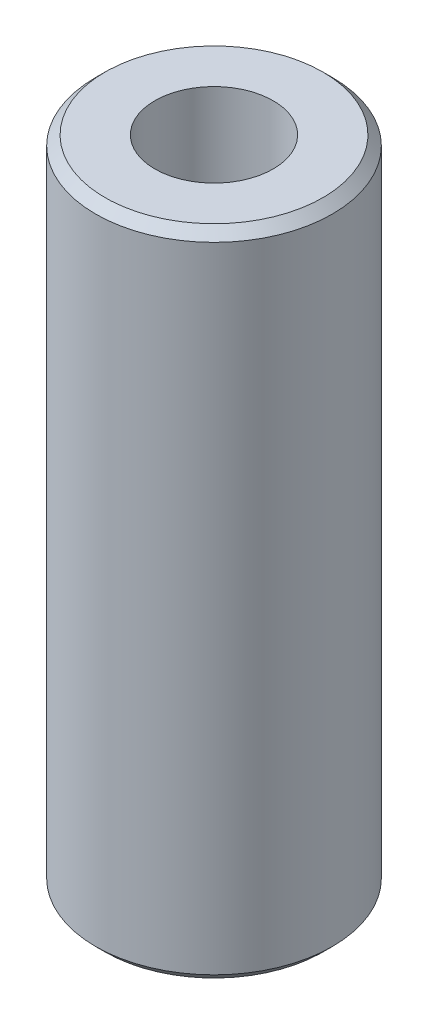
ISO-10303-21;
HEADER;
FILE_DESCRIPTION(('STEP AP214'),'2;1');
FILE_NAME('part.step','',(''),(''),'','','');
FILE_SCHEMA(('AUTOMOTIVE_DESIGN { 1 0 10303 214 1 1 1 1 }'));
ENDSEC;
DATA;
#1=APPLICATION_CONTEXT('core data for automotive mechanical design processes');
#2=APPLICATION_PROTOCOL_DEFINITION('international standard','automotive_design',2000,#1);
#3=PRODUCT_CONTEXT('',#1,'mechanical');
#4=PRODUCT('Part','Part','',(#3));
#5=PRODUCT_RELATED_PRODUCT_CATEGORY('part','',(#4));
#6=PRODUCT_DEFINITION_FORMATION('','',#4);
#7=PRODUCT_DEFINITION_CONTEXT('part definition',#1,'design');
#8=PRODUCT_DEFINITION('design','',#6,#7);
#9=PRODUCT_DEFINITION_SHAPE('','',#8);
#10=(LENGTH_UNIT() NAMED_UNIT(*) SI_UNIT(.MILLI.,.METRE.));
#11=(NAMED_UNIT(*) PLANE_ANGLE_UNIT() SI_UNIT($,.RADIAN.));
#12=(NAMED_UNIT(*) SI_UNIT($,.STERADIAN.) SOLID_ANGLE_UNIT());
#13=UNCERTAINTY_MEASURE_WITH_UNIT(LENGTH_MEASURE(1.E-05),#10,'distance_accuracy_value','');
#14=(GEOMETRIC_REPRESENTATION_CONTEXT(3) GLOBAL_UNCERTAINTY_ASSIGNED_CONTEXT((#13)) GLOBAL_UNIT_ASSIGNED_CONTEXT((#10,
#11,#12)) REPRESENTATION_CONTEXT('',''));
#15=CARTESIAN_POINT('',(0.,0.,0.));
#16=DIRECTION('',(0.,0.,1.));
#17=DIRECTION('',(1.,0.,0.));
#18=AXIS2_PLACEMENT_3D('',#15,#16,#17);
#19=CARTESIAN_POINT('',(0.,6.9,0.));
#20=DIRECTION('',(0.,-1.,0.));
#21=DIRECTION('',(0.,0.,-1.));
#22=AXIS2_PLACEMENT_3D('',#19,#20,#21);
#23=CYLINDRICAL_SURFACE('',#22,2.5);
#24=CARTESIAN_POINT('',(0.,-6.69999999999999,0.));
#25=DIRECTION('',(0.,1.,0.));
#26=DIRECTION('',(0.,0.,1.));
#27=AXIS2_PLACEMENT_3D('',#24,#25,#26);
#28=CIRCLE('',#27,2.5);
#29=CARTESIAN_POINT('',(0.,-6.69999999999999,-2.5));
#30=VERTEX_POINT('',#29);
#31=EDGE_CURVE('E62',#30,#30,#28,.T.);
#32=CARTESIAN_POINT('',(0.,6.70000000000001,0.));
#33=DIRECTION('',(0.,1.,0.));
#34=DIRECTION('',(0.,0.,1.));
#35=AXIS2_PLACEMENT_3D('',#32,#33,#34);
#36=CIRCLE('',#35,2.5);
#37=CARTESIAN_POINT('',(0.,6.70000000000001,-2.5));
#38=VERTEX_POINT('',#37);
#39=EDGE_CURVE('E66',#38,#38,#36,.F.);
#40=CARTESIAN_POINT('',(0.,-6.69999999999999,-2.5));
#41=CARTESIAN_POINT('',(0.,-6.56041666666665,-2.5));
#42=CARTESIAN_POINT('',(0.,-6.42083333333332,-2.5));
#43=CARTESIAN_POINT('',(0.,-6.14166666666666,-2.5));
#44=CARTESIAN_POINT('',(0.,-6.00208333333332,-2.5));
#45=CARTESIAN_POINT('',(0.,-5.72291666666665,-2.5));
#46=CARTESIAN_POINT('',(0.,-5.58333333333332,-2.5));
#47=CARTESIAN_POINT('',(0.,-5.30416666666665,-2.5));
#48=CARTESIAN_POINT('',(0.,-5.16458333333332,-2.5));
#49=CARTESIAN_POINT('',(0.,-4.88541666666666,-2.5));
#50=CARTESIAN_POINT('',(0.,-4.74583333333332,-2.5));
#51=CARTESIAN_POINT('',(0.,-4.46666666666665,-2.5));
#52=CARTESIAN_POINT('',(0.,-4.32708333333332,-2.5));
#53=CARTESIAN_POINT('',(0.,-4.04791666666665,-2.5));
#54=CARTESIAN_POINT('',(0.,-3.90833333333332,-2.5));
#55=CARTESIAN_POINT('',(0.,-3.62916666666665,-2.5));
#56=CARTESIAN_POINT('',(0.,-3.48958333333332,-2.5));
#57=CARTESIAN_POINT('',(0.,-3.21041666666665,-2.5));
#58=CARTESIAN_POINT('',(0.,-3.07083333333332,-2.5));
#59=CARTESIAN_POINT('',(0.,-2.79166666666665,-2.5));
#60=CARTESIAN_POINT('',(0.,-2.65208333333332,-2.5));
#61=CARTESIAN_POINT('',(0.,-2.37291666666665,-2.5));
#62=CARTESIAN_POINT('',(0.,-2.23333333333332,-2.5));
#63=CARTESIAN_POINT('',(0.,-1.95416666666665,-2.5));
#64=CARTESIAN_POINT('',(0.,-1.81458333333332,-2.5));
#65=CARTESIAN_POINT('',(0.,-1.53541666666665,-2.5));
#66=CARTESIAN_POINT('',(0.,-1.39583333333332,-2.5));
#67=CARTESIAN_POINT('',(0.,-1.11666666666665,-2.5));
#68=CARTESIAN_POINT('',(0.,-0.977083333333321,-2.5));
#69=CARTESIAN_POINT('',(0.,-0.697916666666654,-2.5));
#70=CARTESIAN_POINT('',(0.,-0.558333333333321,-2.5));
#71=CARTESIAN_POINT('',(0.,-0.279166666666654,-2.5));
#72=CARTESIAN_POINT('',(0.,-0.139583333333321,-2.5));
#73=CARTESIAN_POINT('',(0.,0.139583333333345,-2.5));
#74=CARTESIAN_POINT('',(0.,0.279166666666679,-2.5));
#75=CARTESIAN_POINT('',(0.,0.558333333333345,-2.5));
#76=CARTESIAN_POINT('',(0.,0.697916666666679,-2.5));
#77=CARTESIAN_POINT('',(0.,0.977083333333345,-2.5));
#78=CARTESIAN_POINT('',(0.,1.11666666666668,-2.5));
#79=CARTESIAN_POINT('',(0.,1.39583333333335,-2.5));
#80=CARTESIAN_POINT('',(0.,1.53541666666668,-2.5));
#81=CARTESIAN_POINT('',(0.,1.81458333333335,-2.5));
#82=CARTESIAN_POINT('',(0.,1.95416666666668,-2.5));
#83=CARTESIAN_POINT('',(0.,2.23333333333335,-2.5));
#84=CARTESIAN_POINT('',(0.,2.37291666666668,-2.5));
#85=CARTESIAN_POINT('',(0.,2.65208333333335,-2.5));
#86=CARTESIAN_POINT('',(0.,2.79166666666668,-2.5));
#87=CARTESIAN_POINT('',(0.,3.07083333333335,-2.5));
#88=CARTESIAN_POINT('',(0.,3.21041666666668,-2.5));
#89=CARTESIAN_POINT('',(0.,3.48958333333335,-2.5));
#90=CARTESIAN_POINT('',(0.,3.62916666666668,-2.5));
#91=CARTESIAN_POINT('',(0.,3.90833333333335,-2.5));
#92=CARTESIAN_POINT('',(0.,4.04791666666668,-2.5));
#93=CARTESIAN_POINT('',(0.,4.32708333333335,-2.5));
#94=CARTESIAN_POINT('',(0.,4.46666666666668,-2.5));
#95=CARTESIAN_POINT('',(0.,4.74583333333335,-2.5));
#96=CARTESIAN_POINT('',(0.,4.88541666666668,-2.5));
#97=CARTESIAN_POINT('',(0.,5.16458333333335,-2.5));
#98=CARTESIAN_POINT('',(0.,5.30416666666668,-2.5));
#99=CARTESIAN_POINT('',(0.,5.58333333333335,-2.5));
#100=CARTESIAN_POINT('',(0.,5.72291666666668,-2.5));
#101=CARTESIAN_POINT('',(0.,6.00208333333335,-2.5));
#102=CARTESIAN_POINT('',(0.,6.14166666666668,-2.5));
#103=CARTESIAN_POINT('',(0.,6.42083333333334,-2.5));
#104=CARTESIAN_POINT('',(0.,6.56041666666668,-2.5));
#105=CARTESIAN_POINT('',(0.,6.70000000000001,-2.5));
#106=B_SPLINE_CURVE_WITH_KNOTS('',3,(#40,#41,#42,#43,#44,#45,#46,#47,#48,#49,#50,#51,#52,#53,
#54,#55,#56,#57,#58,#59,#60,#61,#62,#63,#64,#65,#66,#67,#68,#69,#70,#71,#72,#73,#74,#75,#76,#77,
#78,#79,#80,#81,#82,#83,#84,#85,#86,#87,#88,#89,#90,#91,#92,#93,#94,#95,#96,#97,#98,#99,#100,
#101,#102,#103,#104,#105),.UNSPECIFIED.,.F.,.F.,(4,2,2,2,2,2,2,2,2,2,2,2,2,2,2,2,2,2,2,2,2,2,2,
2,2,2,2,2,2,2,2,2,4),(0.,0.418750000000001,0.8375,1.25625,1.675,2.09375,2.5125,2.93125,3.35,
3.76875,4.1875,4.60625,5.025,5.44375,5.8625,6.28125,6.7,7.11875,7.5375,7.95625,8.375,8.79375,
9.2125,9.63125,10.05,10.46875,10.8875,11.30625,11.725,12.14375,12.5625,12.98125,13.4),.UNSPECIFIED.);
#107=EDGE_CURVE('BSEAM51',#30,#38,#106,.T.);
#108=ORIENTED_EDGE('',*,*,#31,.T.);
#109=ORIENTED_EDGE('',*,*,#39,.T.);
#110=ORIENTED_EDGE('',*,*,#107,.T.);
#111=ORIENTED_EDGE('',*,*,#107,.F.);
#112=EDGE_LOOP('',(#108,#110,#109,#111));
#113=FACE_BOUND('',#112,.T.);
#114=ADVANCED_FACE('F51',(#113),#23,.T.);
#115=CARTESIAN_POINT('',(0.,6.9,0.));
#116=DIRECTION('',(0.,1.,0.));
#117=DIRECTION('',(0.,0.,1.));
#118=AXIS2_PLACEMENT_3D('',#115,#116,#117);
#119=PLANE('',#118);
#120=CARTESIAN_POINT('',(0.,6.9,0.));
#121=DIRECTION('',(0.,1.,0.));
#122=DIRECTION('',(0.,0.,1.));
#123=AXIS2_PLACEMENT_3D('',#120,#121,#122);
#124=CIRCLE('',#123,2.30000000000001);
#125=CARTESIAN_POINT('',(0.,6.9,-2.30000000000001));
#126=VERTEX_POINT('',#125);
#127=EDGE_CURVE('E12',#126,#126,#124,.T.);
#128=ORIENTED_EDGE('',*,*,#127,.T.);
#129=EDGE_LOOP('',(#128));
#130=FACE_BOUND('',#129,.T.);
#131=CARTESIAN_POINT('',(0.,6.9,0.));
#132=DIRECTION('',(0.,1.,0.));
#133=DIRECTION('',(0.,0.,1.));
#134=AXIS2_PLACEMENT_3D('',#131,#132,#133);
#135=CIRCLE('',#134,1.25);
#136=CARTESIAN_POINT('',(0.,6.9,1.25));
#137=VERTEX_POINT('',#136);
#138=EDGE_CURVE('E75',#137,#137,#135,.T.);
#139=ORIENTED_EDGE('',*,*,#138,.F.);
#140=EDGE_LOOP('',(#139));
#141=FACE_BOUND('',#140,.T.);
#142=ADVANCED_FACE('F92',(#130,#141),#119,.T.);
#143=CARTESIAN_POINT('',(0.,-6.9,0.));
#144=DIRECTION('',(0.,1.,0.));
#145=DIRECTION('',(0.,0.,1.));
#146=AXIS2_PLACEMENT_3D('',#143,#144,#145);
#147=PLANE('',#146);
#148=CARTESIAN_POINT('',(0.,-6.9,0.));
#149=DIRECTION('',(0.,1.,0.));
#150=DIRECTION('',(0.,0.,1.));
#151=AXIS2_PLACEMENT_3D('',#148,#149,#150);
#152=CIRCLE('',#151,2.29999999999999);
#153=CARTESIAN_POINT('',(0.,-6.9,2.29999999999999));
#154=VERTEX_POINT('',#153);
#155=EDGE_CURVE('E58',#154,#154,#152,.F.);
#156=ORIENTED_EDGE('',*,*,#155,.T.);
#157=EDGE_LOOP('',(#156));
#158=FACE_BOUND('',#157,.T.);
#159=CARTESIAN_POINT('',(0.,-6.9,0.));
#160=DIRECTION('',(0.,-1.,0.));
#161=DIRECTION('',(0.,0.,-1.));
#162=AXIS2_PLACEMENT_3D('',#159,#160,#161);
#163=CIRCLE('',#162,1.24999999999999);
#164=CARTESIAN_POINT('',(0.,-6.9,-1.24999999999999));
#165=VERTEX_POINT('',#164);
#166=EDGE_CURVE('E83',#165,#165,#163,.T.);
#167=ORIENTED_EDGE('',*,*,#166,.F.);
#168=EDGE_LOOP('',(#167));
#169=FACE_BOUND('',#168,.T.);
#170=ADVANCED_FACE('F89',(#158,#169),#147,.F.);
#171=CARTESIAN_POINT('',(0.,0.4,0.));
#172=DIRECTION('',(0.,1.,0.));
#173=DIRECTION('',(0.,0.,1.));
#174=AXIS2_PLACEMENT_3D('',#171,#172,#173);
#175=CONICAL_SURFACE('',#174,1.25,1.02974425867665);
#176=CARTESIAN_POINT('',(0.,0.,0.));
#177=DIRECTION('',(0.,-1.,0.));
#178=DIRECTION('',(0.,0.,-1.));
#179=AXIS2_PLACEMENT_3D('',#176,#177,#178);
#180=CIRCLE('',#179,0.584288207059792);
#181=CARTESIAN_POINT('',(0.,0.,-0.584288207059792));
#182=VERTEX_POINT('',#181);
#183=EDGE_CURVE('E72',#182,#182,#180,.T.);
#184=ORIENTED_EDGE('',*,*,#183,.T.);
#185=EDGE_LOOP('',(#184));
#186=FACE_BOUND('',#185,.T.);
#187=CARTESIAN_POINT('',(0.,0.4,0.));
#188=DIRECTION('',(0.,1.,0.));
#189=DIRECTION('',(0.,0.,1.));
#190=AXIS2_PLACEMENT_3D('',#187,#188,#189);
#191=CIRCLE('',#190,1.25);
#192=CARTESIAN_POINT('',(0.,0.4,1.25));
#193=VERTEX_POINT('',#192);
#194=EDGE_CURVE('E71',#193,#193,#191,.T.);
#195=ORIENTED_EDGE('',*,*,#194,.T.);
#196=EDGE_LOOP('',(#195));
#197=FACE_BOUND('',#196,.T.);
#198=ADVANCED_FACE('F91',(#186,#197),#175,.F.);
#199=CARTESIAN_POINT('',(0.,6.9,0.));
#200=DIRECTION('',(0.,1.,0.));
#201=DIRECTION('',(0.,0.,1.));
#202=AXIS2_PLACEMENT_3D('',#199,#200,#201);
#203=CYLINDRICAL_SURFACE('',#202,1.25);
#204=ORIENTED_EDGE('',*,*,#194,.F.);
#205=EDGE_LOOP('',(#204));
#206=FACE_BOUND('',#205,.T.);
#207=ORIENTED_EDGE('',*,*,#138,.T.);
#208=EDGE_LOOP('',(#207));
#209=FACE_BOUND('',#208,.T.);
#210=ADVANCED_FACE('F98',(#206,#209),#203,.F.);
#211=CARTESIAN_POINT('',(0.,-0.4,0.));
#212=DIRECTION('',(0.,-1.,0.));
#213=DIRECTION('',(0.,0.,-1.));
#214=AXIS2_PLACEMENT_3D('',#211,#212,#213);
#215=CONICAL_SURFACE('',#214,1.25,1.02974425867665);
#216=CARTESIAN_POINT('',(0.,-0.4,0.));
#217=DIRECTION('',(0.,-1.,0.));
#218=DIRECTION('',(0.,0.,-1.));
#219=AXIS2_PLACEMENT_3D('',#216,#217,#218);
#220=CIRCLE('',#219,1.25);
#221=CARTESIAN_POINT('',(0.,-0.4,-1.25));
#222=VERTEX_POINT('',#221);
#223=EDGE_CURVE('E76',#222,#222,#220,.T.);
#224=ORIENTED_EDGE('',*,*,#223,.T.);
#225=EDGE_LOOP('',(#224));
#226=FACE_BOUND('',#225,.T.);
#227=ORIENTED_EDGE('',*,*,#183,.F.);
#228=EDGE_LOOP('',(#227));
#229=FACE_BOUND('',#228,.T.);
#230=ADVANCED_FACE('F116',(#226,#229),#215,.F.);
#231=CARTESIAN_POINT('',(0.,-6.9,0.));
#232=DIRECTION('',(0.,-1.,0.));
#233=DIRECTION('',(0.,0.,-1.));
#234=AXIS2_PLACEMENT_3D('',#231,#232,#233);
#235=CYLINDRICAL_SURFACE('',#234,1.24999999999999);
#236=ORIENTED_EDGE('',*,*,#223,.F.);
#237=EDGE_LOOP('',(#236));
#238=FACE_BOUND('',#237,.T.);
#239=ORIENTED_EDGE('',*,*,#166,.T.);
#240=EDGE_LOOP('',(#239));
#241=FACE_BOUND('',#240,.T.);
#242=ADVANCED_FACE('F87',(#238,#241),#235,.F.);
#243=CARTESIAN_POINT('',(0.,-6.69999999999999,0.));
#244=DIRECTION('',(0.,1.,0.));
#245=DIRECTION('',(0.,0.,1.));
#246=AXIS2_PLACEMENT_3D('',#243,#244,#245);
#247=CONICAL_SURFACE('',#246,2.5,0.785398163397449);
#248=ORIENTED_EDGE('',*,*,#155,.F.);
#249=EDGE_LOOP('',(#248));
#250=FACE_BOUND('',#249,.T.);
#251=ORIENTED_EDGE('',*,*,#31,.F.);
#252=EDGE_LOOP('',(#251));
#253=FACE_BOUND('',#252,.T.);
#254=ADVANCED_FACE('F108',(#250,#253),#247,.T.);
#255=CARTESIAN_POINT('',(0.,6.9,0.));
#256=DIRECTION('',(0.,-1.,0.));
#257=DIRECTION('',(0.,0.,-1.));
#258=AXIS2_PLACEMENT_3D('',#255,#256,#257);
#259=CONICAL_SURFACE('',#258,2.30000000000001,0.785398163397445);
#260=CARTESIAN_POINT('',(0.,6.70000000000001,-2.5));
#261=CARTESIAN_POINT('',(0.,6.70208333333335,-2.49791666666667));
#262=CARTESIAN_POINT('',(0.,6.70416666666668,-2.49583333333333));
#263=CARTESIAN_POINT('',(0.,6.70833333333334,-2.49166666666667));
#264=CARTESIAN_POINT('',(0.,6.71041666666668,-2.48958333333333));
#265=CARTESIAN_POINT('',(0.,6.71458333333334,-2.48541666666667));
#266=CARTESIAN_POINT('',(0.,6.71666666666668,-2.48333333333334));
#267=CARTESIAN_POINT('',(0.,6.72083333333334,-2.47916666666667));
#268=CARTESIAN_POINT('',(0.,6.72291666666668,-2.47708333333334));
#269=CARTESIAN_POINT('',(0.,6.72708333333334,-2.47291666666667));
#270=CARTESIAN_POINT('',(0.,6.72916666666668,-2.47083333333334));
#271=CARTESIAN_POINT('',(0.,6.73333333333334,-2.46666666666667));
#272=CARTESIAN_POINT('',(0.,6.73541666666668,-2.46458333333334));
#273=CARTESIAN_POINT('',(0.,6.73958333333334,-2.46041666666667));
#274=CARTESIAN_POINT('',(0.,6.74166666666668,-2.45833333333334));
#275=CARTESIAN_POINT('',(0.,6.74583333333334,-2.45416666666667));
#276=CARTESIAN_POINT('',(0.,6.74791666666668,-2.45208333333334));
#277=CARTESIAN_POINT('',(0.,6.75208333333334,-2.44791666666667));
#278=CARTESIAN_POINT('',(0.,6.75416666666668,-2.44583333333334));
#279=CARTESIAN_POINT('',(0.,6.75833333333334,-2.44166666666667));
#280=CARTESIAN_POINT('',(0.,6.76041666666667,-2.43958333333334));
#281=CARTESIAN_POINT('',(0.,6.76458333333334,-2.43541666666667));
#282=CARTESIAN_POINT('',(0.,6.76666666666668,-2.43333333333334));
#283=CARTESIAN_POINT('',(0.,6.77083333333334,-2.42916666666667));
#284=CARTESIAN_POINT('',(0.,6.77291666666667,-2.42708333333334));
#285=CARTESIAN_POINT('',(0.,6.77708333333334,-2.42291666666667));
#286=CARTESIAN_POINT('',(0.,6.77916666666667,-2.42083333333334));
#287=CARTESIAN_POINT('',(0.,6.78333333333334,-2.41666666666667));
#288=CARTESIAN_POINT('',(0.,6.78541666666667,-2.41458333333334));
#289=CARTESIAN_POINT('',(0.,6.78958333333334,-2.41041666666667));
#290=CARTESIAN_POINT('',(0.,6.79166666666667,-2.40833333333334));
#291=CARTESIAN_POINT('',(0.,6.79583333333334,-2.40416666666667));
#292=CARTESIAN_POINT('',(0.,6.79791666666667,-2.40208333333334));
#293=CARTESIAN_POINT('',(0.,6.80208333333334,-2.39791666666667));
#294=CARTESIAN_POINT('',(0.,6.80416666666667,-2.39583333333334));
#295=CARTESIAN_POINT('',(0.,6.80833333333334,-2.39166666666667));
#296=CARTESIAN_POINT('',(0.,6.81041666666667,-2.38958333333334));
#297=CARTESIAN_POINT('',(0.,6.81458333333334,-2.38541666666667));
#298=CARTESIAN_POINT('',(0.,6.81666666666667,-2.38333333333334));
#299=CARTESIAN_POINT('',(0.,6.82083333333334,-2.37916666666668));
#300=CARTESIAN_POINT('',(0.,6.82291666666667,-2.37708333333334));
#301=CARTESIAN_POINT('',(0.,6.82708333333334,-2.37291666666668));
#302=CARTESIAN_POINT('',(0.,6.82916666666667,-2.37083333333334));
#303=CARTESIAN_POINT('',(0.,6.83333333333334,-2.36666666666668));
#304=CARTESIAN_POINT('',(0.,6.83541666666667,-2.36458333333334));
#305=CARTESIAN_POINT('',(0.,6.83958333333334,-2.36041666666668));
#306=CARTESIAN_POINT('',(0.,6.84166666666667,-2.35833333333334));
#307=CARTESIAN_POINT('',(0.,6.84583333333334,-2.35416666666668));
#308=CARTESIAN_POINT('',(0.,6.84791666666667,-2.35208333333334));
#309=CARTESIAN_POINT('',(0.,6.85208333333334,-2.34791666666668));
#310=CARTESIAN_POINT('',(0.,6.85416666666667,-2.34583333333334));
#311=CARTESIAN_POINT('',(0.,6.85833333333334,-2.34166666666668));
#312=CARTESIAN_POINT('',(0.,6.86041666666667,-2.33958333333334));
#313=CARTESIAN_POINT('',(0.,6.86458333333334,-2.33541666666668));
#314=CARTESIAN_POINT('',(0.,6.86666666666667,-2.33333333333334));
#315=CARTESIAN_POINT('',(0.,6.87083333333334,-2.32916666666668));
#316=CARTESIAN_POINT('',(0.,6.87291666666667,-2.32708333333335));
#317=CARTESIAN_POINT('',(0.,6.87708333333333,-2.32291666666668));
#318=CARTESIAN_POINT('',(0.,6.87916666666667,-2.32083333333335));
#319=CARTESIAN_POINT('',(0.,6.88333333333333,-2.31666666666668));
#320=CARTESIAN_POINT('',(0.,6.88541666666667,-2.31458333333335));
#321=CARTESIAN_POINT('',(0.,6.88958333333333,-2.31041666666668));
#322=CARTESIAN_POINT('',(0.,6.89166666666667,-2.30833333333335));
#323=CARTESIAN_POINT('',(0.,6.89583333333333,-2.30416666666668));
#324=CARTESIAN_POINT('',(0.,6.89791666666667,-2.30208333333335));
#325=CARTESIAN_POINT('',(0.,6.9,-2.30000000000001));
#326=B_SPLINE_CURVE_WITH_KNOTS('',3,(#260,#261,#262,#263,#264,#265,#266,#267,#268,#269,#270,
#271,#272,#273,#274,#275,#276,#277,#278,#279,#280,#281,#282,#283,#284,#285,#286,#287,#288,#289,
#290,#291,#292,#293,#294,#295,#296,#297,#298,#299,#300,#301,#302,#303,#304,#305,#306,#307,#308,
#309,#310,#311,#312,#313,#314,#315,#316,#317,#318,#319,#320,#321,#322,#323,#324,#325),
.UNSPECIFIED.,.F.,.F.,(4,2,2,2,2,2,2,2,2,2,2,2,2,2,2,2,2,2,2,2,2,2,2,2,2,2,2,2,2,2,2,2,4),(0.,
0.00883883476483118,0.017677669529662,0.0265165042944938,0.035355339059325,0.0441941738241559,
0.0530330085889877,0.0618718433538188,0.0707106781186503,0.0795495128834815,0.0883883476483127,
0.0972271824131442,0.106066017177975,0.114904851942807,0.123743686707638,0.132582521472469,
0.141421356237301,0.150260191002132,0.159099025766963,0.167937860531794,0.176776695296626,
0.185615530061457,0.194454364826288,0.20329319959112,0.212132034355951,0.220970869120782,
0.229809703885613,0.238648538650445,0.247487373415276,0.256326208180107,0.265165042944939,
0.27400387770977,0.282842712474602),.UNSPECIFIED.);
#327=EDGE_CURVE('BSEAM53',#38,#126,#326,.T.);
#328=ORIENTED_EDGE('',*,*,#39,.F.);
#329=ORIENTED_EDGE('',*,*,#127,.F.);
#330=ORIENTED_EDGE('',*,*,#327,.T.);
#331=ORIENTED_EDGE('',*,*,#327,.F.);
#332=EDGE_LOOP('',(#328,#330,#329,#331));
#333=FACE_BOUND('',#332,.T.);
#334=ADVANCED_FACE('F53',(#333),#259,.T.);
#335=CLOSED_SHELL('',(#114,#142,#170,#198,#210,#230,#242,#254,#334));
#336=MANIFOLD_SOLID_BREP('B2',#335);
#337=ADVANCED_BREP_SHAPE_REPRESENTATION('',(#18,#336),#14);
#338=SHAPE_DEFINITION_REPRESENTATION(#9,#337);
ENDSEC;
END-ISO-10303-21;
